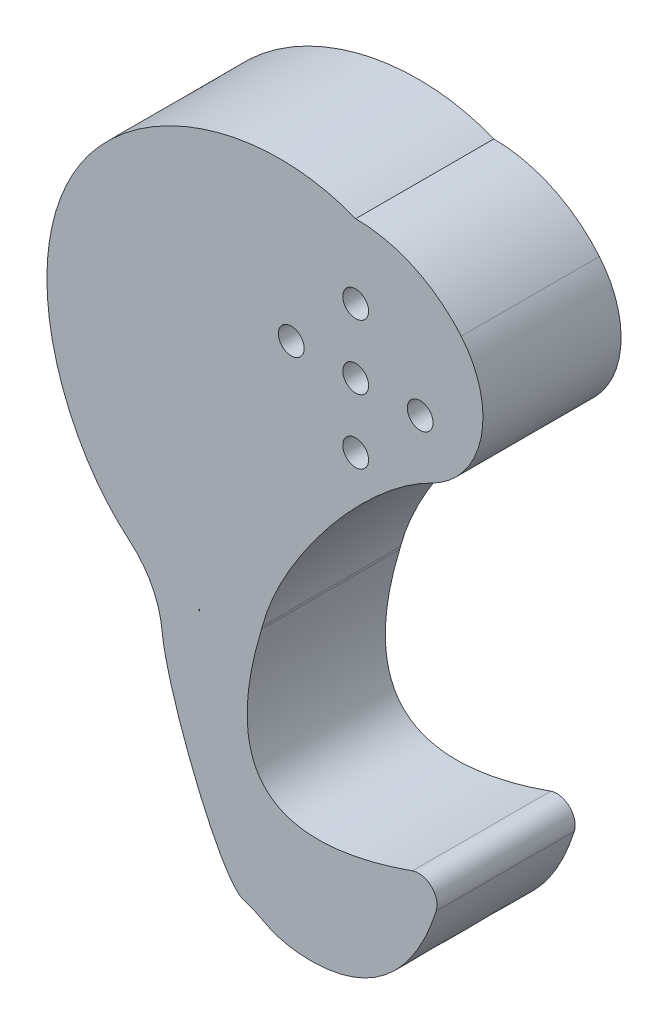
ISO-10303-21;
HEADER;
FILE_DESCRIPTION(('STEP AP214'),'2;1');
FILE_NAME('part.step','',(''),(''),'','','');
FILE_SCHEMA(('AUTOMOTIVE_DESIGN { 1 0 10303 214 1 1 1 1 }'));
ENDSEC;
DATA;
#1=APPLICATION_CONTEXT('core data for automotive mechanical design processes');
#2=APPLICATION_PROTOCOL_DEFINITION('international standard','automotive_design',2000,#1);
#3=PRODUCT_CONTEXT('',#1,'mechanical');
#4=PRODUCT('Part','Part','',(#3));
#5=PRODUCT_RELATED_PRODUCT_CATEGORY('part','',(#4));
#6=PRODUCT_DEFINITION_FORMATION('','',#4);
#7=PRODUCT_DEFINITION_CONTEXT('part definition',#1,'design');
#8=PRODUCT_DEFINITION('design','',#6,#7);
#9=PRODUCT_DEFINITION_SHAPE('','',#8);
#10=(LENGTH_UNIT() NAMED_UNIT(*) SI_UNIT(.MILLI.,.METRE.));
#11=(NAMED_UNIT(*) PLANE_ANGLE_UNIT() SI_UNIT($,.RADIAN.));
#12=(NAMED_UNIT(*) SI_UNIT($,.STERADIAN.) SOLID_ANGLE_UNIT());
#13=UNCERTAINTY_MEASURE_WITH_UNIT(LENGTH_MEASURE(1.E-05),#10,'distance_accuracy_value','');
#14=(GEOMETRIC_REPRESENTATION_CONTEXT(3) GLOBAL_UNCERTAINTY_ASSIGNED_CONTEXT((#13)) GLOBAL_UNIT_ASSIGNED_CONTEXT((#10,
#11,#12)) REPRESENTATION_CONTEXT('',''));
#15=CARTESIAN_POINT('',(0.,0.,0.));
#16=DIRECTION('',(0.,0.,1.));
#17=DIRECTION('',(1.,0.,0.));
#18=AXIS2_PLACEMENT_3D('',#15,#16,#17);
#19=CARTESIAN_POINT('',(0.,0.,15.));
#20=DIRECTION('',(0.,0.,-1.));
#21=DIRECTION('',(-1.,0.,0.));
#22=AXIS2_PLACEMENT_3D('',#19,#20,#21);
#23=CYLINDRICAL_SURFACE('',#22,15.);
#24=CARTESIAN_POINT('',(0.,0.,15.));
#25=DIRECTION('',(0.,0.,1.));
#26=DIRECTION('',(1.,0.,0.));
#27=AXIS2_PLACEMENT_3D('',#24,#25,#26);
#28=CIRCLE('',#27,15.);
#29=CARTESIAN_POINT('',(11.4588768433459,9.67957341462062,15.));
#30=VERTEX_POINT('',#29);
#31=CARTESIAN_POINT('',(0.,15.,15.));
#32=VERTEX_POINT('',#31);
#33=EDGE_CURVE('E251',#30,#32,#28,.T.);
#34=ORIENTED_EDGE('',*,*,#33,.F.);
#35=DIRECTION('',(0.,0.,-1.));
#36=VECTOR('',#35,1.);
#37=CARTESIAN_POINT('',(11.4588768433459,9.67957341462062,15.));
#38=LINE('',#37,#36);
#39=CARTESIAN_POINT('',(11.4588768433459,9.67957341462062,0.));
#40=VERTEX_POINT('',#39);
#41=EDGE_CURVE('E300',#30,#40,#38,.T.);
#42=ORIENTED_EDGE('',*,*,#41,.T.);
#43=CARTESIAN_POINT('',(0.,0.,0.));
#44=DIRECTION('',(0.,0.,1.));
#45=DIRECTION('',(1.,0.,0.));
#46=AXIS2_PLACEMENT_3D('',#43,#44,#45);
#47=CIRCLE('',#46,15.);
#48=CARTESIAN_POINT('',(0.,15.,0.));
#49=VERTEX_POINT('',#48);
#50=EDGE_CURVE('E248',#40,#49,#47,.T.);
#51=ORIENTED_EDGE('',*,*,#50,.T.);
#52=DIRECTION('',(0.,0.,-1.));
#53=VECTOR('',#52,1.);
#54=CARTESIAN_POINT('',(0.,15.,15.));
#55=LINE('',#54,#53);
#56=EDGE_CURVE('E254',#32,#49,#55,.T.);
#57=ORIENTED_EDGE('',*,*,#56,.F.);
#58=EDGE_LOOP('',(#34,#42,#51,#57));
#59=FACE_BOUND('',#58,.T.);
#60=ADVANCED_FACE('F35',(#59),#23,.T.);
#61=CARTESIAN_POINT('',(-0.663232511998917,-26.6439498070473,15.));
#62=DIRECTION('',(0.,0.,-1.));
#63=DIRECTION('',(-1.,0.,0.));
#64=AXIS2_PLACEMENT_3D('',#61,#62,#63);
#65=PLANE('',#64);
#66=CARTESIAN_POINT('',(-20.6189407453854,-30.087622849411,15.));
#67=CARTESIAN_POINT('',(-27.2903694928282,-26.9921762061212,15.));
#68=CARTESIAN_POINT('',(-35.897228225267,-12.3609043232939,15.));
#69=CARTESIAN_POINT('',(-30.4708046787518,12.3486639993236,15.));
#70=CARTESIAN_POINT('',(-9.95549146365545,18.9943660538746,15.));
#71=CARTESIAN_POINT('',(0.,15.,15.));
#72=B_SPLINE_CURVE_WITH_KNOTS('',3,(#66,#67,#68,#69,#70,#71),.UNSPECIFIED.,.F.,.F.,(4,1,1,4),
(0.,0.264681679850527,0.520287314372477,0.947421442626808),.UNSPECIFIED.);
#73=CARTESIAN_POINT('',(-24.5605723774005,-27.564634345385,15.));
#74=VERTEX_POINT('',#73);
#75=EDGE_CURVE('E157',#32,#74,#72,.F.);
#76=ORIENTED_EDGE('',*,*,#75,.T.);
#77=CARTESIAN_POINT('',(-30.9763489414997,-35.2352152281836,15.));
#78=DIRECTION('',(0.,0.,-1.));
#79=DIRECTION('',(-1.,0.,0.));
#80=AXIS2_PLACEMENT_3D('',#77,#78,#79);
#81=CIRCLE('',#80,10.);
#82=CARTESIAN_POINT('',(-21.0183577207999,-34.3195674528544,15.));
#83=VERTEX_POINT('',#82);
#84=EDGE_CURVE('E327',#74,#83,#81,.T.);
#85=ORIENTED_EDGE('',*,*,#84,.T.);
#86=CARTESIAN_POINT('',(-20.8334103830735,-32.6498734482656,15.));
#87=CARTESIAN_POINT('',(-19.7191344034232,-31.183703784207,15.));
#88=CARTESIAN_POINT('',(-10.8684886821129,-42.8683161547755,15.));
#89=CARTESIAN_POINT('',(-10.8150643737643,-60.8898452257468,15.));
#90=CARTESIAN_POINT('',(-19.0215076618822,-44.0853385897146,15.));
#91=CARTESIAN_POINT('',(-21.5083842863362,-33.5380073388533,15.));
#92=CARTESIAN_POINT('',(-20.8334103830735,-32.6498734482656,15.));
#93=B_SPLINE_CURVE_WITH_KNOTS('',3,(#86,#87,#88,#89,#90,#91,#92),.UNSPECIFIED.,.T.,.F.,(4,1,1,1,
4),(0.,0.32100677511927,0.505595322193137,0.80554979203261,1.),.UNSPECIFIED.);
#94=CARTESIAN_POINT('',(-12.2280265157516,-55.1216759026115,15.));
#95=VERTEX_POINT('',#94);
#96=EDGE_CURVE('E153',#83,#95,#93,.F.);
#97=ORIENTED_EDGE('',*,*,#96,.T.);
#98=CARTESIAN_POINT('',(-15.080716298435,-64.7061509014716,15.));
#99=DIRECTION('',(0.,0.,-1.));
#100=DIRECTION('',(-1.,0.,0.));
#101=AXIS2_PLACEMENT_3D('',#98,#99,#100);
#102=CIRCLE('',#101,10.);
#103=CARTESIAN_POINT('',(-10.252017850747,-55.949229564535,15.));
#104=VERTEX_POINT('',#103);
#105=EDGE_CURVE('E43',#95,#104,#102,.T.);
#106=ORIENTED_EDGE('',*,*,#105,.T.);
#107=CARTESIAN_POINT('',(-5.42331940305899,-47.1923082275985,15.));
#108=DIRECTION('',(0.,0.,-1.));
#109=DIRECTION('',(-1.,0.,0.));
#110=AXIS2_PLACEMENT_3D('',#107,#108,#109);
#111=CIRCLE('',#110,10.);
#112=CARTESIAN_POINT('',(-6.35756856531042,-57.1485715077067,15.));
#113=VERTEX_POINT('',#112);
#114=EDGE_CURVE('E309',#104,#113,#111,.F.);
#115=ORIENTED_EDGE('',*,*,#114,.T.);
#116=CARTESIAN_POINT('',(9.70799794556584,-41.8897932185024,15.));
#117=CARTESIAN_POINT('',(2.46300109947236,-79.7630971534452,15.));
#118=CARTESIAN_POINT('',(-48.0133922539971,-36.7446340108556,15.));
#119=CARTESIAN_POINT('',(-17.3340031980191,-27.0077733257087,15.));
#120=B_SPLINE_CURVE_WITH_KNOTS('',3,(#116,#117,#118,#119),.UNSPECIFIED.,.F.,.F.,(4,4),(0.,1.),.UNSPECIFIED.);
#121=CARTESIAN_POINT('',(8.74096646696146,-45.7410038437068,15.));
#122=VERTEX_POINT('',#121);
#123=EDGE_CURVE('E283',#113,#122,#120,.F.);
#124=ORIENTED_EDGE('',*,*,#123,.T.);
#125=CARTESIAN_POINT('',(6.83586573425813,-45.132241822673,15.));
#126=DIRECTION('',(0.,0.,-1.));
#127=DIRECTION('',(-1.,0.,0.));
#128=AXIS2_PLACEMENT_3D('',#125,#126,#127);
#129=CIRCLE('',#128,2.);
#130=CARTESIAN_POINT('',(6.16993637708358,-43.2463632233848,15.));
#131=VERTEX_POINT('',#130);
#132=EDGE_CURVE('E289',#122,#131,#129,.F.);
#133=ORIENTED_EDGE('',*,*,#132,.T.);
#134=CARTESIAN_POINT('',(-10.1718747216876,-28.5411895481463,15.));
#135=CARTESIAN_POINT('',(-17.6838462909149,-53.1512329882088,15.));
#136=CARTESIAN_POINT('',(9.70799794556584,-41.8897932185024,15.));
#137=B_SPLINE_CURVE_WITH_KNOTS('',2,(#134,#135,#136),.UNSPECIFIED.,.F.,.F.,(3,3),(0.,1.),.UNSPECIFIED.);
#138=CARTESIAN_POINT('',(-10.2265783661404,-28.7214630946807,15.));
#139=VERTEX_POINT('',#138);
#140=EDGE_CURVE('E215',#131,#139,#137,.F.);
#141=ORIENTED_EDGE('',*,*,#140,.T.);
#142=CARTESIAN_POINT('',(-19.8004924040379,-25.8335278469734,15.));
#143=DIRECTION('',(0.,0.,-1.));
#144=DIRECTION('',(-1.,0.,0.));
#145=AXIS2_PLACEMENT_3D('',#142,#143,#144);
#146=CIRCLE('',#145,10.);
#147=CARTESIAN_POINT('',(-10.130657705996,-28.3819188908568,15.));
#148=VERTEX_POINT('',#147);
#149=EDGE_CURVE('E294',#139,#148,#146,.F.);
#150=ORIENTED_EDGE('',*,*,#149,.T.);
#151=CARTESIAN_POINT('',(14.0953893117886,-5.13030214988504,15.));
#152=CARTESIAN_POINT('',(22.9688326693545,-9.55111886198153,15.));
#153=CARTESIAN_POINT('',(14.5414573886167,-65.5030612476907,15.));
#154=CARTESIAN_POINT('',(-12.75593691509,-38.1787369666644,15.));
#155=CARTESIAN_POINT('',(-8.44249956636855,-18.7625097220735,15.));
#156=CARTESIAN_POINT('',(8.47755327126531,-2.33145366987668,15.));
#157=CARTESIAN_POINT('',(14.0953893117886,-5.13030214988504,15.));
#158=B_SPLINE_CURVE_WITH_KNOTS('',3,(#151,#152,#153,#154,#155,#156,#157),.UNSPECIFIED.,.T.,.F.,
(4,1,1,1,4),(0.,0.425967943453537,0.605024053105648,0.730316860274936,1.),.UNSPECIFIED.);
#159=CARTESIAN_POINT('',(8.19787957705277,-5.76407574418184,15.));
#160=VERTEX_POINT('',#159);
#161=EDGE_CURVE('E207',#148,#160,#158,.T.);
#162=ORIENTED_EDGE('',*,*,#161,.T.);
#163=CARTESIAN_POINT('',(3.81962561444865,3.22652447154021,15.));
#164=DIRECTION('',(0.,0.,-1.));
#165=DIRECTION('',(-1.,0.,0.));
#166=AXIS2_PLACEMENT_3D('',#163,#164,#165);
#167=CIRCLE('',#166,10.);
#168=EDGE_CURVE('E307',#160,#30,#167,.F.);
#169=ORIENTED_EDGE('',*,*,#168,.T.);
#170=ORIENTED_EDGE('',*,*,#33,.T.);
#171=EDGE_LOOP('',(#76,#85,#97,#106,#115,#124,#133,#141,#150,#162,#169,#170));
#172=FACE_BOUND('',#171,.T.);
#173=CARTESIAN_POINT('',(7.,0.,15.));
#174=DIRECTION('',(0.,0.,1.));
#175=DIRECTION('',(1.,0.,0.));
#176=AXIS2_PLACEMENT_3D('',#173,#174,#175);
#177=CIRCLE('',#176,1.4);
#178=CARTESIAN_POINT('',(8.4,0.,15.));
#179=VERTEX_POINT('',#178);
#180=EDGE_CURVE('E237',#179,#179,#177,.T.);
#181=ORIENTED_EDGE('',*,*,#180,.F.);
#182=EDGE_LOOP('',(#181));
#183=FACE_BOUND('',#182,.T.);
#184=CARTESIAN_POINT('',(0.,-7.,15.));
#185=DIRECTION('',(0.,0.,1.));
#186=DIRECTION('',(1.,0.,0.));
#187=AXIS2_PLACEMENT_3D('',#184,#185,#186);
#188=CIRCLE('',#187,1.4);
#189=CARTESIAN_POINT('',(1.39999999999997,-7.,15.));
#190=VERTEX_POINT('',#189);
#191=EDGE_CURVE('E224',#190,#190,#188,.T.);
#192=ORIENTED_EDGE('',*,*,#191,.F.);
#193=EDGE_LOOP('',(#192));
#194=FACE_BOUND('',#193,.T.);
#195=CARTESIAN_POINT('',(-7.,0.,15.));
#196=DIRECTION('',(0.,0.,1.));
#197=DIRECTION('',(1.,0.,0.));
#198=AXIS2_PLACEMENT_3D('',#195,#196,#197);
#199=CIRCLE('',#198,1.4);
#200=CARTESIAN_POINT('',(-5.6,0.,15.));
#201=VERTEX_POINT('',#200);
#202=EDGE_CURVE('E225',#201,#201,#199,.T.);
#203=ORIENTED_EDGE('',*,*,#202,.F.);
#204=EDGE_LOOP('',(#203));
#205=FACE_BOUND('',#204,.T.);
#206=CARTESIAN_POINT('',(0.,7.,15.));
#207=DIRECTION('',(0.,0.,1.));
#208=DIRECTION('',(1.,0.,0.));
#209=AXIS2_PLACEMENT_3D('',#206,#207,#208);
#210=CIRCLE('',#209,1.4);
#211=CARTESIAN_POINT('',(1.40000000000007,7.,15.));
#212=VERTEX_POINT('',#211);
#213=EDGE_CURVE('E214',#212,#212,#210,.T.);
#214=ORIENTED_EDGE('',*,*,#213,.F.);
#215=EDGE_LOOP('',(#214));
#216=FACE_BOUND('',#215,.T.);
#217=CARTESIAN_POINT('',(0.,0.,15.));
#218=DIRECTION('',(0.,0.,1.));
#219=DIRECTION('',(1.,0.,0.));
#220=AXIS2_PLACEMENT_3D('',#217,#218,#219);
#221=CIRCLE('',#220,1.4);
#222=CARTESIAN_POINT('',(1.4,0.,15.));
#223=VERTEX_POINT('',#222);
#224=EDGE_CURVE('E236',#223,#223,#221,.T.);
#225=ORIENTED_EDGE('',*,*,#224,.F.);
#226=EDGE_LOOP('',(#225));
#227=FACE_BOUND('',#226,.T.);
#228=CARTESIAN_POINT('',(-17.3340049092058,-28.8385355045429,15.));
#229=CARTESIAN_POINT('',(-16.3578197671665,-30.4174780719955,15.));
#230=CARTESIAN_POINT('',(-18.8940760898741,-39.0494671080646,15.));
#231=CARTESIAN_POINT('',(-16.6276608781053,-45.9681983362416,15.));
#232=CARTESIAN_POINT('',(-10.6169214720701,-60.726222639326,15.));
#233=CARTESIAN_POINT('',(-45.520515414304,-46.00234559863,15.));
#234=CARTESIAN_POINT('',(-19.5090627191951,-25.3204617140652,15.));
#235=CARTESIAN_POINT('',(-17.3340049092058,-28.8385355045429,15.));
#236=B_SPLINE_CURVE_WITH_KNOTS('',3,(#228,#229,#230,#231,#232,#233,#234,#235),.UNSPECIFIED.,.T.,
.F.,(4,1,1,1,1,4),(0.,0.142925417258084,0.277103605774089,0.387123084815801,0.681544994217224,
1.),.UNSPECIFIED.);
#237=CARTESIAN_POINT('',(-17.0247459038454,-29.81773745513,15.));
#238=VERTEX_POINT('',#237);
#239=CARTESIAN_POINT('',(-16.9762739429387,-30.5815886834805,15.));
#240=VERTEX_POINT('',#239);
#241=EDGE_CURVE('E156',#238,#240,#236,.T.);
#242=ORIENTED_EDGE('',*,*,#241,.T.);
#243=DIRECTION('',(-0.0633299443907787,0.997992644333344,0.));
#244=VECTOR('',#243,1.);
#245=CARTESIAN_POINT('',(-16.9762739429387,-30.5815886834805,15.));
#246=LINE('',#245,#244);
#247=EDGE_CURVE('E140',#240,#238,#246,.T.);
#248=ORIENTED_EDGE('',*,*,#247,.T.);
#249=EDGE_LOOP('',(#242,#248));
#250=FACE_BOUND('',#249,.T.);
#251=ADVANCED_FACE('F330',(#172,#183,#194,#205,#216,#227,#250),#65,.F.);
#252=CARTESIAN_POINT('',(-0.663232511998917,-26.6439498070473,0.));
#253=DIRECTION('',(0.,0.,-1.));
#254=DIRECTION('',(-1.,0.,0.));
#255=AXIS2_PLACEMENT_3D('',#252,#253,#254);
#256=PLANE('',#255);
#257=CARTESIAN_POINT('',(-5.42331940305899,-47.1923082275985,0.));
#258=DIRECTION('',(0.,0.,-1.));
#259=DIRECTION('',(-1.,0.,0.));
#260=AXIS2_PLACEMENT_3D('',#257,#258,#259);
#261=CIRCLE('',#260,10.);
#262=CARTESIAN_POINT('',(-6.35756856531018,-57.1485715077068,0.));
#263=VERTEX_POINT('',#262);
#264=CARTESIAN_POINT('',(-10.252017850747,-55.949229564535,0.));
#265=VERTEX_POINT('',#264);
#266=EDGE_CURVE('E314',#263,#265,#261,.T.);
#267=ORIENTED_EDGE('',*,*,#266,.T.);
#268=CARTESIAN_POINT('',(-15.080716298435,-64.7061509014716,0.));
#269=DIRECTION('',(0.,0.,-1.));
#270=DIRECTION('',(-1.,0.,0.));
#271=AXIS2_PLACEMENT_3D('',#268,#269,#270);
#272=CIRCLE('',#271,10.);
#273=CARTESIAN_POINT('',(-12.2280265157516,-55.1216759026115,0.));
#274=VERTEX_POINT('',#273);
#275=EDGE_CURVE('E11',#265,#274,#272,.F.);
#276=ORIENTED_EDGE('',*,*,#275,.T.);
#277=CARTESIAN_POINT('',(-20.8334103830735,-32.6498734482656,0.));
#278=CARTESIAN_POINT('',(-19.7191344034232,-31.183703784207,0.));
#279=CARTESIAN_POINT('',(-10.8684886821129,-42.8683161547755,0.));
#280=CARTESIAN_POINT('',(-10.8150643737643,-60.8898452257468,0.));
#281=CARTESIAN_POINT('',(-19.0215076618822,-44.0853385897146,0.));
#282=CARTESIAN_POINT('',(-21.5083842863362,-33.5380073388533,0.));
#283=CARTESIAN_POINT('',(-20.8334103830735,-32.6498734482656,0.));
#284=B_SPLINE_CURVE_WITH_KNOTS('',3,(#277,#278,#279,#280,#281,#282,#283),.UNSPECIFIED.,.T.,.F.,
(4,1,1,1,4),(0.,0.32100677511927,0.505595322193137,0.80554979203261,1.),.UNSPECIFIED.);
#285=CARTESIAN_POINT('',(-21.0183577207999,-34.3195674528544,0.));
#286=VERTEX_POINT('',#285);
#287=EDGE_CURVE('E340',#274,#286,#284,.T.);
#288=ORIENTED_EDGE('',*,*,#287,.T.);
#289=CARTESIAN_POINT('',(-30.9763489414997,-35.2352152281836,0.));
#290=DIRECTION('',(0.,0.,-1.));
#291=DIRECTION('',(-1.,0.,0.));
#292=AXIS2_PLACEMENT_3D('',#289,#290,#291);
#293=CIRCLE('',#292,10.);
#294=CARTESIAN_POINT('',(-24.5605723774005,-27.564634345385,0.));
#295=VERTEX_POINT('',#294);
#296=EDGE_CURVE('E325',#286,#295,#293,.F.);
#297=ORIENTED_EDGE('',*,*,#296,.T.);
#298=CARTESIAN_POINT('',(-20.6189407453854,-30.087622849411,0.));
#299=CARTESIAN_POINT('',(-27.2903694928282,-26.9921762061212,0.));
#300=CARTESIAN_POINT('',(-35.897228225267,-12.3609043232939,0.));
#301=CARTESIAN_POINT('',(-30.4708046787518,12.3486639993236,0.));
#302=CARTESIAN_POINT('',(-9.95549146365545,18.9943660538746,0.));
#303=CARTESIAN_POINT('',(0.,15.,0.));
#304=B_SPLINE_CURVE_WITH_KNOTS('',3,(#298,#299,#300,#301,#302,#303),.UNSPECIFIED.,.F.,.F.,(4,1,
1,4),(0.,0.264681679850527,0.520287314372477,0.947421442626808),.UNSPECIFIED.);
#305=EDGE_CURVE('E152',#295,#49,#304,.T.);
#306=ORIENTED_EDGE('',*,*,#305,.T.);
#307=ORIENTED_EDGE('',*,*,#50,.F.);
#308=CARTESIAN_POINT('',(3.81962561444865,3.22652447154021,0.));
#309=DIRECTION('',(0.,0.,-1.));
#310=DIRECTION('',(-1.,0.,0.));
#311=AXIS2_PLACEMENT_3D('',#308,#309,#310);
#312=CIRCLE('',#311,10.);
#313=CARTESIAN_POINT('',(8.19787957705277,-5.76407574418184,0.));
#314=VERTEX_POINT('',#313);
#315=EDGE_CURVE('E303',#40,#314,#312,.T.);
#316=ORIENTED_EDGE('',*,*,#315,.T.);
#317=CARTESIAN_POINT('',(14.0953893117886,-5.13030214988504,0.));
#318=CARTESIAN_POINT('',(22.9688326693545,-9.55111886198153,0.));
#319=CARTESIAN_POINT('',(14.5414573886167,-65.5030612476907,0.));
#320=CARTESIAN_POINT('',(-12.75593691509,-38.1787369666644,0.));
#321=CARTESIAN_POINT('',(-8.44249956636855,-18.7625097220735,0.));
#322=CARTESIAN_POINT('',(8.47755327126531,-2.33145366987668,0.));
#323=CARTESIAN_POINT('',(14.0953893117886,-5.13030214988504,0.));
#324=B_SPLINE_CURVE_WITH_KNOTS('',3,(#317,#318,#319,#320,#321,#322,#323),.UNSPECIFIED.,.T.,.F.,
(4,1,1,1,4),(0.,0.425967943453537,0.605024053105648,0.730316860274936,1.),.UNSPECIFIED.);
#325=CARTESIAN_POINT('',(-10.130657705996,-28.3819188908568,0.));
#326=VERTEX_POINT('',#325);
#327=EDGE_CURVE('E259',#326,#314,#324,.T.);
#328=ORIENTED_EDGE('',*,*,#327,.F.);
#329=CARTESIAN_POINT('',(-19.8004924040379,-25.8335278469734,0.));
#330=DIRECTION('',(0.,0.,-1.));
#331=DIRECTION('',(-1.,0.,0.));
#332=AXIS2_PLACEMENT_3D('',#329,#330,#331);
#333=CIRCLE('',#332,10.);
#334=CARTESIAN_POINT('',(-10.2265783661404,-28.7214630946807,0.));
#335=VERTEX_POINT('',#334);
#336=EDGE_CURVE('E298',#326,#335,#333,.T.);
#337=ORIENTED_EDGE('',*,*,#336,.T.);
#338=CARTESIAN_POINT('',(-10.1718747216876,-28.5411895481463,0.));
#339=CARTESIAN_POINT('',(-17.6838462909149,-53.1512329882088,0.));
#340=CARTESIAN_POINT('',(9.70799794556584,-41.8897932185024,0.));
#341=B_SPLINE_CURVE_WITH_KNOTS('',2,(#338,#339,#340),.UNSPECIFIED.,.F.,.F.,(3,3),(0.,1.),.UNSPECIFIED.);
#342=CARTESIAN_POINT('',(6.16993637708515,-43.2463632233843,0.));
#343=VERTEX_POINT('',#342);
#344=EDGE_CURVE('E159',#335,#343,#341,.T.);
#345=ORIENTED_EDGE('',*,*,#344,.T.);
#346=CARTESIAN_POINT('',(6.83586573425813,-45.132241822673,0.));
#347=DIRECTION('',(0.,0.,-1.));
#348=DIRECTION('',(-1.,0.,0.));
#349=AXIS2_PLACEMENT_3D('',#346,#347,#348);
#350=CIRCLE('',#349,2.);
#351=CARTESIAN_POINT('',(8.74096646696146,-45.7410038437068,0.));
#352=VERTEX_POINT('',#351);
#353=EDGE_CURVE('E284',#343,#352,#350,.T.);
#354=ORIENTED_EDGE('',*,*,#353,.T.);
#355=CARTESIAN_POINT('',(9.70799794556584,-41.8897932185024,0.));
#356=CARTESIAN_POINT('',(2.46300109947236,-79.7630971534452,0.));
#357=CARTESIAN_POINT('',(-48.0133922539971,-36.7446340108556,0.));
#358=CARTESIAN_POINT('',(-17.3340031980191,-27.0077733257087,0.));
#359=B_SPLINE_CURVE_WITH_KNOTS('',3,(#355,#356,#357,#358),.UNSPECIFIED.,.F.,.F.,(4,4),(0.,1.),.UNSPECIFIED.);
#360=EDGE_CURVE('E280',#352,#263,#359,.T.);
#361=ORIENTED_EDGE('',*,*,#360,.T.);
#362=EDGE_LOOP('',(#267,#276,#288,#297,#306,#307,#316,#328,#337,#345,#354,#361));
#363=FACE_BOUND('',#362,.T.);
#364=DIRECTION('',(0.0633299443907787,-0.997992644333344,0.));
#365=VECTOR('',#364,1.);
#366=CARTESIAN_POINT('',(-16.9762739429387,-30.5815886834805,0.));
#367=LINE('',#366,#365);
#368=CARTESIAN_POINT('',(-17.0247458950662,-29.8177375204156,0.));
#369=VERTEX_POINT('',#368);
#370=CARTESIAN_POINT('',(-16.9762739429387,-30.5815886834805,0.));
#371=VERTEX_POINT('',#370);
#372=EDGE_CURVE('E137',#369,#371,#367,.T.);
#373=ORIENTED_EDGE('',*,*,#372,.T.);
#374=CARTESIAN_POINT('',(-17.3340049092058,-28.8385355045429,0.));
#375=CARTESIAN_POINT('',(-16.3578197671665,-30.4174780719955,0.));
#376=CARTESIAN_POINT('',(-18.8940760898741,-39.0494671080646,0.));
#377=CARTESIAN_POINT('',(-16.6276608781053,-45.9681983362416,0.));
#378=CARTESIAN_POINT('',(-10.6169214720701,-60.726222639326,0.));
#379=CARTESIAN_POINT('',(-45.520515414304,-46.00234559863,0.));
#380=CARTESIAN_POINT('',(-19.5090627191951,-25.3204617140652,0.));
#381=CARTESIAN_POINT('',(-17.3340049092058,-28.8385355045429,0.));
#382=B_SPLINE_CURVE_WITH_KNOTS('',3,(#374,#375,#376,#377,#378,#379,#380,#381),.UNSPECIFIED.,.T.,
.F.,(4,1,1,1,1,4),(0.,0.142925417258084,0.277103605774089,0.387123084815801,0.681544994217224,
1.),.UNSPECIFIED.);
#383=EDGE_CURVE('E151',#369,#371,#382,.T.);
#384=ORIENTED_EDGE('',*,*,#383,.F.);
#385=EDGE_LOOP('',(#373,#384));
#386=FACE_BOUND('',#385,.T.);
#387=CARTESIAN_POINT('',(7.,0.,0.));
#388=DIRECTION('',(0.,0.,1.));
#389=DIRECTION('',(1.,0.,0.));
#390=AXIS2_PLACEMENT_3D('',#387,#388,#389);
#391=CIRCLE('',#390,1.4);
#392=CARTESIAN_POINT('',(8.4,0.,0.));
#393=VERTEX_POINT('',#392);
#394=EDGE_CURVE('E233',#393,#393,#391,.T.);
#395=ORIENTED_EDGE('',*,*,#394,.T.);
#396=EDGE_LOOP('',(#395));
#397=FACE_BOUND('',#396,.T.);
#398=CARTESIAN_POINT('',(0.,-7.,0.));
#399=DIRECTION('',(0.,0.,1.));
#400=DIRECTION('',(1.,0.,0.));
#401=AXIS2_PLACEMENT_3D('',#398,#399,#400);
#402=CIRCLE('',#401,1.4);
#403=CARTESIAN_POINT('',(1.39999999999997,-7.,0.));
#404=VERTEX_POINT('',#403);
#405=EDGE_CURVE('E240',#404,#404,#402,.T.);
#406=ORIENTED_EDGE('',*,*,#405,.T.);
#407=EDGE_LOOP('',(#406));
#408=FACE_BOUND('',#407,.T.);
#409=CARTESIAN_POINT('',(-7.,0.,0.));
#410=DIRECTION('',(0.,0.,1.));
#411=DIRECTION('',(1.,0.,0.));
#412=AXIS2_PLACEMENT_3D('',#409,#410,#411);
#413=CIRCLE('',#412,1.4);
#414=CARTESIAN_POINT('',(-5.6,0.,0.));
#415=VERTEX_POINT('',#414);
#416=EDGE_CURVE('E218',#415,#415,#413,.T.);
#417=ORIENTED_EDGE('',*,*,#416,.T.);
#418=EDGE_LOOP('',(#417));
#419=FACE_BOUND('',#418,.T.);
#420=CARTESIAN_POINT('',(0.,7.,0.));
#421=DIRECTION('',(0.,0.,1.));
#422=DIRECTION('',(1.,0.,0.));
#423=AXIS2_PLACEMENT_3D('',#420,#421,#422);
#424=CIRCLE('',#423,1.4);
#425=CARTESIAN_POINT('',(1.40000000000007,7.,0.));
#426=VERTEX_POINT('',#425);
#427=EDGE_CURVE('E228',#426,#426,#424,.T.);
#428=ORIENTED_EDGE('',*,*,#427,.T.);
#429=EDGE_LOOP('',(#428));
#430=FACE_BOUND('',#429,.T.);
#431=CARTESIAN_POINT('',(0.,0.,0.));
#432=DIRECTION('',(0.,0.,1.));
#433=DIRECTION('',(1.,0.,0.));
#434=AXIS2_PLACEMENT_3D('',#431,#432,#433);
#435=CIRCLE('',#434,1.4);
#436=CARTESIAN_POINT('',(1.4,0.,0.));
#437=VERTEX_POINT('',#436);
#438=EDGE_CURVE('E245',#437,#437,#435,.T.);
#439=ORIENTED_EDGE('',*,*,#438,.T.);
#440=EDGE_LOOP('',(#439));
#441=FACE_BOUND('',#440,.T.);
#442=ADVANCED_FACE('F149',(#363,#386,#397,#408,#419,#430,#441),#256,.T.);
#443=CARTESIAN_POINT('',(0.,0.,0.));
#444=DIRECTION('',(0.,0.,1.));
#445=DIRECTION('',(1.,0.,0.));
#446=AXIS2_PLACEMENT_3D('',#443,#444,#445);
#447=CYLINDRICAL_SURFACE('',#446,1.4);
#448=ORIENTED_EDGE('',*,*,#438,.F.);
#449=EDGE_LOOP('',(#448));
#450=FACE_BOUND('',#449,.T.);
#451=ORIENTED_EDGE('',*,*,#224,.T.);
#452=EDGE_LOOP('',(#451));
#453=FACE_BOUND('',#452,.T.);
#454=ADVANCED_FACE('F428',(#450,#453),#447,.F.);
#455=CARTESIAN_POINT('',(0.,7.,0.));
#456=DIRECTION('',(0.,0.,1.));
#457=DIRECTION('',(1.,0.,0.));
#458=AXIS2_PLACEMENT_3D('',#455,#456,#457);
#459=CYLINDRICAL_SURFACE('',#458,1.4);
#460=ORIENTED_EDGE('',*,*,#427,.F.);
#461=EDGE_LOOP('',(#460));
#462=FACE_BOUND('',#461,.T.);
#463=ORIENTED_EDGE('',*,*,#213,.T.);
#464=EDGE_LOOP('',(#463));
#465=FACE_BOUND('',#464,.T.);
#466=ADVANCED_FACE('F499',(#462,#465),#459,.F.);
#467=CARTESIAN_POINT('',(-7.,0.,0.));
#468=DIRECTION('',(0.,0.,1.));
#469=DIRECTION('',(1.,0.,0.));
#470=AXIS2_PLACEMENT_3D('',#467,#468,#469);
#471=CYLINDRICAL_SURFACE('',#470,1.4);
#472=ORIENTED_EDGE('',*,*,#416,.F.);
#473=EDGE_LOOP('',(#472));
#474=FACE_BOUND('',#473,.T.);
#475=ORIENTED_EDGE('',*,*,#202,.T.);
#476=EDGE_LOOP('',(#475));
#477=FACE_BOUND('',#476,.T.);
#478=ADVANCED_FACE('F205',(#474,#477),#471,.F.);
#479=CARTESIAN_POINT('',(0.,-7.,0.));
#480=DIRECTION('',(0.,0.,1.));
#481=DIRECTION('',(1.,0.,0.));
#482=AXIS2_PLACEMENT_3D('',#479,#480,#481);
#483=CYLINDRICAL_SURFACE('',#482,1.4);
#484=ORIENTED_EDGE('',*,*,#405,.F.);
#485=EDGE_LOOP('',(#484));
#486=FACE_BOUND('',#485,.T.);
#487=ORIENTED_EDGE('',*,*,#191,.T.);
#488=EDGE_LOOP('',(#487));
#489=FACE_BOUND('',#488,.T.);
#490=ADVANCED_FACE('F515',(#486,#489),#483,.F.);
#491=CARTESIAN_POINT('',(7.,0.,0.));
#492=DIRECTION('',(0.,0.,1.));
#493=DIRECTION('',(1.,0.,0.));
#494=AXIS2_PLACEMENT_3D('',#491,#492,#493);
#495=CYLINDRICAL_SURFACE('',#494,1.4);
#496=ORIENTED_EDGE('',*,*,#394,.F.);
#497=EDGE_LOOP('',(#496));
#498=FACE_BOUND('',#497,.T.);
#499=ORIENTED_EDGE('',*,*,#180,.T.);
#500=EDGE_LOOP('',(#499));
#501=FACE_BOUND('',#500,.T.);
#502=ADVANCED_FACE('F203',(#498,#501),#495,.F.);
#503=DIRECTION('',(0.,0.,-1.));
#504=VECTOR('',#503,1.);
#505=SURFACE_OF_LINEAR_EXTRUSION('',#158,#504);
#506=ORIENTED_EDGE('',*,*,#327,.T.);
#507=DIRECTION('',(0.,0.,-1.));
#508=VECTOR('',#507,1.);
#509=CARTESIAN_POINT('',(8.1978795770528,-5.76407574418182,0.));
#510=LINE('',#509,#508);
#511=EDGE_CURVE('E305',#314,#160,#510,.F.);
#512=ORIENTED_EDGE('',*,*,#511,.T.);
#513=ORIENTED_EDGE('',*,*,#161,.F.);
#514=DIRECTION('',(0.,0.,-1.));
#515=VECTOR('',#514,1.);
#516=CARTESIAN_POINT('',(-10.130657705996,-28.3819188908568,15.));
#517=LINE('',#516,#515);
#518=EDGE_CURVE('E296',#148,#326,#517,.T.);
#519=ORIENTED_EDGE('',*,*,#518,.T.);
#520=EDGE_LOOP('',(#506,#512,#513,#519));
#521=FACE_BOUND('',#520,.T.);
#522=ADVANCED_FACE('F199',(#521),#505,.F.);
#523=CARTESIAN_POINT('',(9.70799794556584,-41.8897932185024,65.3557178231574));
#524=CARTESIAN_POINT('',(2.46300109947236,-79.7630971534452,65.3557178231574));
#525=CARTESIAN_POINT('',(-48.0133922539971,-36.7446340108556,65.3557178231574));
#526=CARTESIAN_POINT('',(-17.3340031980191,-27.0077733257087,65.3557178231574));
#527=B_SPLINE_CURVE_WITH_KNOTS('',3,(#523,#524,#525,#526),.UNSPECIFIED.,.F.,.F.,(4,4),(0.,1.),.UNSPECIFIED.);
#528=DIRECTION('',(0.,0.,-1.));
#529=VECTOR('',#528,1.);
#530=SURFACE_OF_LINEAR_EXTRUSION('',#527,#529);
#531=ORIENTED_EDGE('',*,*,#123,.F.);
#532=DIRECTION('',(0.,0.,-1.));
#533=VECTOR('',#532,1.);
#534=CARTESIAN_POINT('',(-6.35756856531042,-57.1485715077067,15.));
#535=LINE('',#534,#533);
#536=EDGE_CURVE('E312',#113,#263,#535,.T.);
#537=ORIENTED_EDGE('',*,*,#536,.T.);
#538=ORIENTED_EDGE('',*,*,#360,.F.);
#539=DIRECTION('',(0.,0.,-1.));
#540=VECTOR('',#539,1.);
#541=CARTESIAN_POINT('',(8.7409664669611,-45.741003843708,0.));
#542=LINE('',#541,#540);
#543=EDGE_CURVE('E286',#352,#122,#542,.F.);
#544=ORIENTED_EDGE('',*,*,#543,.T.);
#545=EDGE_LOOP('',(#531,#537,#538,#544));
#546=FACE_BOUND('',#545,.T.);
#547=ADVANCED_FACE('F196',(#546),#530,.T.);
#548=CARTESIAN_POINT('',(-10.1718747216876,-28.5411895481463,65.3557178231574));
#549=CARTESIAN_POINT('',(-17.6838462909149,-53.1512329882088,65.3557178231574));
#550=CARTESIAN_POINT('',(9.70799794556584,-41.8897932185024,65.3557178231574));
#551=B_SPLINE_CURVE_WITH_KNOTS('',2,(#548,#549,#550),.UNSPECIFIED.,.F.,.F.,(3,3),(0.,1.),.UNSPECIFIED.);
#552=DIRECTION('',(0.,0.,-1.));
#553=VECTOR('',#552,1.);
#554=SURFACE_OF_LINEAR_EXTRUSION('',#551,#553);
#555=ORIENTED_EDGE('',*,*,#344,.F.);
#556=DIRECTION('',(0.,0.,-1.));
#557=VECTOR('',#556,1.);
#558=CARTESIAN_POINT('',(-10.2265783661405,-28.7214630946807,0.));
#559=LINE('',#558,#557);
#560=EDGE_CURVE('E291',#335,#139,#559,.F.);
#561=ORIENTED_EDGE('',*,*,#560,.T.);
#562=ORIENTED_EDGE('',*,*,#140,.F.);
#563=DIRECTION('',(0.,0.,-1.));
#564=VECTOR('',#563,1.);
#565=CARTESIAN_POINT('',(6.16993637708358,-43.2463632233848,15.));
#566=LINE('',#565,#564);
#567=EDGE_CURVE('E264',#131,#343,#566,.T.);
#568=ORIENTED_EDGE('',*,*,#567,.T.);
#569=EDGE_LOOP('',(#555,#561,#562,#568));
#570=FACE_BOUND('',#569,.T.);
#571=ADVANCED_FACE('F191',(#570),#554,.T.);
#572=CARTESIAN_POINT('',(6.83586573425813,-45.132241822673,7.5));
#573=DIRECTION('',(0.,0.,-1.));
#574=DIRECTION('',(-1.,0.,0.));
#575=AXIS2_PLACEMENT_3D('',#572,#573,#574);
#576=CYLINDRICAL_SURFACE('',#575,2.);
#577=ORIENTED_EDGE('',*,*,#132,.F.);
#578=ORIENTED_EDGE('',*,*,#543,.F.);
#579=ORIENTED_EDGE('',*,*,#353,.F.);
#580=ORIENTED_EDGE('',*,*,#567,.F.);
#581=EDGE_LOOP('',(#577,#578,#579,#580));
#582=FACE_BOUND('',#581,.T.);
#583=ADVANCED_FACE('F195',(#582),#576,.T.);
#584=CARTESIAN_POINT('',(-19.8004924040379,-25.8335278469734,7.5));
#585=DIRECTION('',(0.,0.,-1.));
#586=DIRECTION('',(-1.,0.,0.));
#587=AXIS2_PLACEMENT_3D('',#584,#585,#586);
#588=CYLINDRICAL_SURFACE('',#587,10.);
#589=ORIENTED_EDGE('',*,*,#336,.F.);
#590=ORIENTED_EDGE('',*,*,#518,.F.);
#591=ORIENTED_EDGE('',*,*,#149,.F.);
#592=ORIENTED_EDGE('',*,*,#560,.F.);
#593=EDGE_LOOP('',(#589,#590,#591,#592));
#594=FACE_BOUND('',#593,.T.);
#595=ADVANCED_FACE('F377',(#594),#588,.T.);
#596=CARTESIAN_POINT('',(3.81962561444865,3.22652447154021,7.5));
#597=DIRECTION('',(0.,0.,-1.));
#598=DIRECTION('',(-1.,0.,0.));
#599=AXIS2_PLACEMENT_3D('',#596,#597,#598);
#600=CYLINDRICAL_SURFACE('',#599,10.);
#601=ORIENTED_EDGE('',*,*,#168,.F.);
#602=ORIENTED_EDGE('',*,*,#511,.F.);
#603=ORIENTED_EDGE('',*,*,#315,.F.);
#604=ORIENTED_EDGE('',*,*,#41,.F.);
#605=EDGE_LOOP('',(#601,#602,#603,#604));
#606=FACE_BOUND('',#605,.T.);
#607=ADVANCED_FACE('F373',(#606),#600,.T.);
#608=CARTESIAN_POINT('',(-17.3340049092058,-28.8385355045429,20.));
#609=CARTESIAN_POINT('',(-16.3578197671665,-30.4174780719955,20.));
#610=CARTESIAN_POINT('',(-18.8940760898741,-39.0494671080646,20.));
#611=CARTESIAN_POINT('',(-16.6276608781053,-45.9681983362416,20.));
#612=CARTESIAN_POINT('',(-10.6169214720701,-60.726222639326,20.));
#613=CARTESIAN_POINT('',(-45.520515414304,-46.00234559863,20.));
#614=CARTESIAN_POINT('',(-19.5090627191951,-25.3204617140652,20.));
#615=CARTESIAN_POINT('',(-17.3340049092058,-28.8385355045429,20.));
#616=B_SPLINE_CURVE_WITH_KNOTS('',3,(#608,#609,#610,#611,#612,#613,#614,#615),.UNSPECIFIED.,.T.,
.F.,(4,1,1,1,1,4),(0.,0.142925417258084,0.277103605774089,0.387123084815801,0.681544994217224,
1.),.UNSPECIFIED.);
#617=DIRECTION('',(0.,0.,-1.));
#618=VECTOR('',#617,1.);
#619=SURFACE_OF_LINEAR_EXTRUSION('',#616,#618);
#620=ORIENTED_EDGE('',*,*,#241,.F.);
#621=DIRECTION('',(0.,0.,-1.));
#622=VECTOR('',#621,1.);
#623=CARTESIAN_POINT('',(-17.0247458950662,-29.8177375204156,42.5061431393092));
#624=LINE('',#623,#622);
#625=EDGE_CURVE('E145',#238,#369,#624,.T.);
#626=ORIENTED_EDGE('',*,*,#625,.T.);
#627=ORIENTED_EDGE('',*,*,#383,.T.);
#628=DIRECTION('',(0.,0.,-1.));
#629=VECTOR('',#628,1.);
#630=CARTESIAN_POINT('',(-16.9762739429387,-30.5815886834805,85.0122862786185));
#631=LINE('',#630,#629);
#632=EDGE_CURVE('E134',#240,#371,#631,.T.);
#633=ORIENTED_EDGE('',*,*,#632,.F.);
#634=EDGE_LOOP('',(#620,#626,#627,#633));
#635=FACE_BOUND('',#634,.T.);
#636=ADVANCED_FACE('F155',(#635),#619,.F.);
#637=CARTESIAN_POINT('',(-20.6189407453854,-30.087622849411,85.0122862786185));
#638=CARTESIAN_POINT('',(-27.2903694928282,-26.9921762061212,85.0122862786185));
#639=CARTESIAN_POINT('',(-35.897228225267,-12.3609043232939,85.0122862786185));
#640=CARTESIAN_POINT('',(-30.4708046787518,12.3486639993236,85.0122862786185));
#641=CARTESIAN_POINT('',(-9.95549146365545,18.9943660538746,85.0122862786185));
#642=CARTESIAN_POINT('',(0.,15.,85.0122862786185));
#643=B_SPLINE_CURVE_WITH_KNOTS('',3,(#637,#638,#639,#640,#641,#642),.UNSPECIFIED.,.F.,.F.,(4,1,
1,4),(0.,0.264681679850527,0.520287314372477,0.947421442626808),.UNSPECIFIED.);
#644=DIRECTION('',(0.,0.,-1.));
#645=VECTOR('',#644,1.);
#646=SURFACE_OF_LINEAR_EXTRUSION('',#643,#645);
#647=ORIENTED_EDGE('',*,*,#305,.F.);
#648=DIRECTION('',(0.,0.,-1.));
#649=VECTOR('',#648,1.);
#650=CARTESIAN_POINT('',(-24.5605723773996,-27.5646343453858,0.));
#651=LINE('',#650,#649);
#652=EDGE_CURVE('E322',#295,#74,#651,.F.);
#653=ORIENTED_EDGE('',*,*,#652,.T.);
#654=ORIENTED_EDGE('',*,*,#75,.F.);
#655=ORIENTED_EDGE('',*,*,#56,.T.);
#656=EDGE_LOOP('',(#647,#653,#654,#655));
#657=FACE_BOUND('',#656,.T.);
#658=ADVANCED_FACE('F347',(#657),#646,.T.);
#659=CARTESIAN_POINT('',(-16.9762739429387,-30.5815886834805,85.0122862786185));
#660=DIRECTION('',(0.997992644333344,0.0633299443907787,0.));
#661=DIRECTION('',(-0.0633299443907787,0.997992644333344,0.));
#662=AXIS2_PLACEMENT_3D('',#659,#660,#661);
#663=PLANE('',#662);
#664=ORIENTED_EDGE('',*,*,#247,.F.);
#665=ORIENTED_EDGE('',*,*,#632,.T.);
#666=ORIENTED_EDGE('',*,*,#372,.F.);
#667=ORIENTED_EDGE('',*,*,#625,.F.);
#668=EDGE_LOOP('',(#664,#665,#666,#667));
#669=FACE_BOUND('',#668,.T.);
#670=ADVANCED_FACE('F136',(#669),#663,.T.);
#671=CARTESIAN_POINT('',(-5.42331940305899,-47.1923082275985,7.5));
#672=DIRECTION('',(0.,0.,-1.));
#673=DIRECTION('',(-1.,0.,0.));
#674=AXIS2_PLACEMENT_3D('',#671,#672,#673);
#675=CYLINDRICAL_SURFACE('',#674,10.);
#676=ORIENTED_EDGE('',*,*,#114,.F.);
#677=DIRECTION('',(0.,0.,-1.));
#678=VECTOR('',#677,1.);
#679=CARTESIAN_POINT('',(-10.252017850747,-55.949229564535,7.5));
#680=LINE('',#679,#678);
#681=EDGE_CURVE('E56',#104,#265,#680,.T.);
#682=ORIENTED_EDGE('',*,*,#681,.T.);
#683=ORIENTED_EDGE('',*,*,#266,.F.);
#684=ORIENTED_EDGE('',*,*,#536,.F.);
#685=EDGE_LOOP('',(#676,#682,#683,#684));
#686=FACE_BOUND('',#685,.T.);
#687=ADVANCED_FACE('F371',(#686),#675,.T.);
#688=CARTESIAN_POINT('',(-20.8334103830735,-32.6498734482656,40.1687688400899));
#689=CARTESIAN_POINT('',(-19.7191344034232,-31.183703784207,40.1687688400899));
#690=CARTESIAN_POINT('',(-10.8684886821129,-42.8683161547755,40.1687688400899));
#691=CARTESIAN_POINT('',(-10.8150643737643,-60.8898452257468,40.1687688400899));
#692=CARTESIAN_POINT('',(-19.0215076618822,-44.0853385897146,40.1687688400899));
#693=CARTESIAN_POINT('',(-21.5083842863362,-33.5380073388533,40.1687688400899));
#694=CARTESIAN_POINT('',(-20.8334103830735,-32.6498734482656,40.1687688400899));
#695=B_SPLINE_CURVE_WITH_KNOTS('',3,(#688,#689,#690,#691,#692,#693,#694),.UNSPECIFIED.,.T.,.F.,
(4,1,1,1,4),(0.,0.32100677511927,0.505595322193137,0.80554979203261,1.),.UNSPECIFIED.);
#696=DIRECTION('',(0.,0.,-1.));
#697=VECTOR('',#696,1.);
#698=SURFACE_OF_LINEAR_EXTRUSION('',#695,#697);
#699=ORIENTED_EDGE('',*,*,#96,.F.);
#700=DIRECTION('',(0.,0.,-1.));
#701=VECTOR('',#700,1.);
#702=CARTESIAN_POINT('',(-21.0183577207999,-34.3195674528544,15.));
#703=LINE('',#702,#701);
#704=EDGE_CURVE('E319',#83,#286,#703,.T.);
#705=ORIENTED_EDGE('',*,*,#704,.T.);
#706=ORIENTED_EDGE('',*,*,#287,.F.);
#707=DIRECTION('',(0.,0.,-1.));
#708=VECTOR('',#707,1.);
#709=CARTESIAN_POINT('',(-12.2280265157419,-55.1216759026144,0.));
#710=LINE('',#709,#708);
#711=EDGE_CURVE('E316',#274,#95,#710,.F.);
#712=ORIENTED_EDGE('',*,*,#711,.T.);
#713=EDGE_LOOP('',(#699,#705,#706,#712));
#714=FACE_BOUND('',#713,.T.);
#715=ADVANCED_FACE('F336',(#714),#698,.T.);
#716=CARTESIAN_POINT('',(-30.9763489414997,-35.2352152281836,7.50000000000002));
#717=DIRECTION('',(0.,0.,-1.));
#718=DIRECTION('',(-1.,0.,0.));
#719=AXIS2_PLACEMENT_3D('',#716,#717,#718);
#720=CYLINDRICAL_SURFACE('',#719,10.);
#721=ORIENTED_EDGE('',*,*,#84,.F.);
#722=ORIENTED_EDGE('',*,*,#652,.F.);
#723=ORIENTED_EDGE('',*,*,#296,.F.);
#724=ORIENTED_EDGE('',*,*,#704,.F.);
#725=EDGE_LOOP('',(#721,#722,#723,#724));
#726=FACE_BOUND('',#725,.T.);
#727=ADVANCED_FACE('F342',(#726),#720,.F.);
#728=CARTESIAN_POINT('',(-15.080716298435,-64.7061509014716,7.5));
#729=DIRECTION('',(0.,0.,-1.));
#730=DIRECTION('',(-1.,0.,0.));
#731=AXIS2_PLACEMENT_3D('',#728,#729,#730);
#732=CYLINDRICAL_SURFACE('',#731,10.);
#733=ORIENTED_EDGE('',*,*,#275,.F.);
#734=ORIENTED_EDGE('',*,*,#681,.F.);
#735=ORIENTED_EDGE('',*,*,#105,.F.);
#736=ORIENTED_EDGE('',*,*,#711,.F.);
#737=EDGE_LOOP('',(#733,#734,#735,#736));
#738=FACE_BOUND('',#737,.T.);
#739=ADVANCED_FACE('F37',(#738),#732,.F.);
#740=CLOSED_SHELL('',(#60,#251,#442,#454,#466,#478,#490,#502,#522,#547,#571,#583,#595,#607,#636,
#658,#670,#687,#715,#727,#739));
#741=MANIFOLD_SOLID_BREP('B2',#740);
#742=ADVANCED_BREP_SHAPE_REPRESENTATION('',(#18,#741),#14);
#743=SHAPE_DEFINITION_REPRESENTATION(#9,#742);
ENDSEC;
END-ISO-10303-21;
